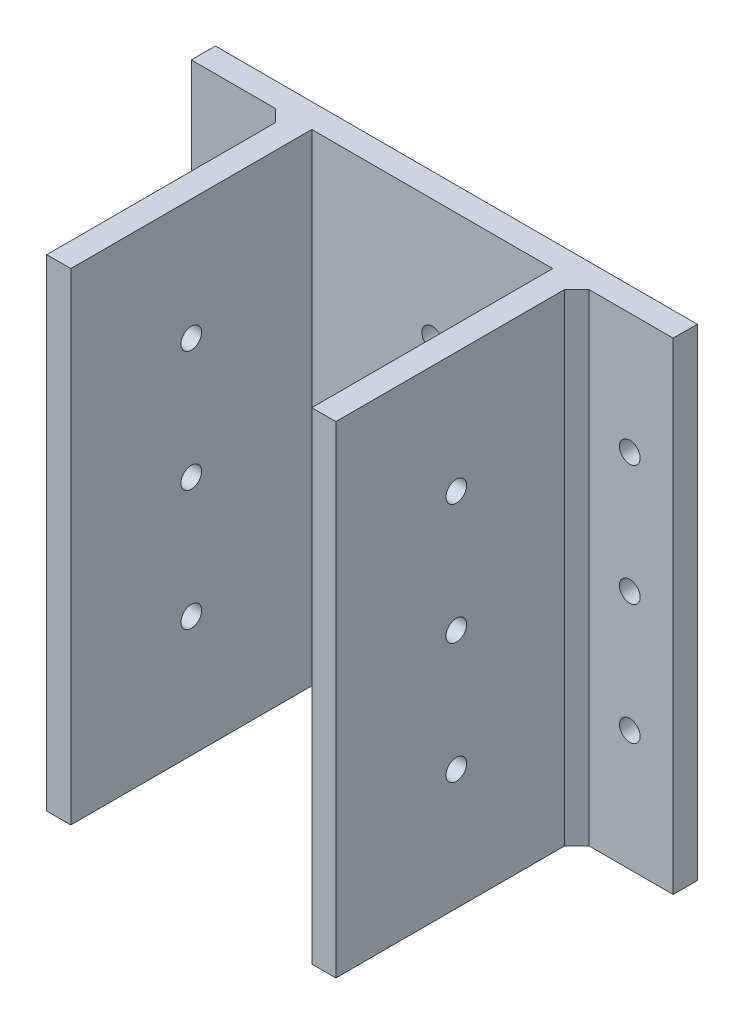
ISO-10303-21;
HEADER;
FILE_DESCRIPTION(('STEP AP214'),'2;1');
FILE_NAME('part.step','',(''),(''),'','','');
FILE_SCHEMA(('AUTOMOTIVE_DESIGN { 1 0 10303 214 1 1 1 1 }'));
ENDSEC;
DATA;
#1=APPLICATION_CONTEXT('core data for automotive mechanical design processes');
#2=APPLICATION_PROTOCOL_DEFINITION('international standard','automotive_design',2000,#1);
#3=PRODUCT_CONTEXT('',#1,'mechanical');
#4=PRODUCT('Part','Part','',(#3));
#5=PRODUCT_RELATED_PRODUCT_CATEGORY('part','',(#4));
#6=PRODUCT_DEFINITION_FORMATION('','',#4);
#7=PRODUCT_DEFINITION_CONTEXT('part definition',#1,'design');
#8=PRODUCT_DEFINITION('design','',#6,#7);
#9=PRODUCT_DEFINITION_SHAPE('','',#8);
#10=(LENGTH_UNIT() NAMED_UNIT(*) SI_UNIT(.MILLI.,.METRE.));
#11=(NAMED_UNIT(*) PLANE_ANGLE_UNIT() SI_UNIT($,.RADIAN.));
#12=(NAMED_UNIT(*) SI_UNIT($,.STERADIAN.) SOLID_ANGLE_UNIT());
#13=UNCERTAINTY_MEASURE_WITH_UNIT(LENGTH_MEASURE(1.E-05),#10,'distance_accuracy_value','');
#14=(GEOMETRIC_REPRESENTATION_CONTEXT(3) GLOBAL_UNCERTAINTY_ASSIGNED_CONTEXT((#13)) GLOBAL_UNIT_ASSIGNED_CONTEXT((#10,
#11,#12)) REPRESENTATION_CONTEXT('',''));
#15=CARTESIAN_POINT('',(0.,0.,0.));
#16=DIRECTION('',(0.,0.,1.));
#17=DIRECTION('',(1.,0.,0.));
#18=AXIS2_PLACEMENT_3D('',#15,#16,#17);
#19=CARTESIAN_POINT('',(0.,-25.,10.));
#20=DIRECTION('',(0.,0.,-1.));
#21=DIRECTION('',(-1.,0.,0.));
#22=AXIS2_PLACEMENT_3D('',#19,#20,#21);
#23=CYLINDRICAL_SURFACE('',#22,2.15);
#24=CARTESIAN_POINT('',(0.,-25.,5.));
#25=DIRECTION('',(0.,0.,1.));
#26=DIRECTION('',(1.,0.,0.));
#27=AXIS2_PLACEMENT_3D('',#24,#25,#26);
#28=CIRCLE('',#27,2.15);
#29=CARTESIAN_POINT('',(2.15000000000001,-25.,5.));
#30=VERTEX_POINT('',#29);
#31=EDGE_CURVE('E274',#30,#30,#28,.T.);
#32=ORIENTED_EDGE('',*,*,#31,.T.);
#33=EDGE_LOOP('',(#32));
#34=FACE_BOUND('',#33,.T.);
#35=CARTESIAN_POINT('',(0.,-25.,0.));
#36=DIRECTION('',(0.,0.,-1.));
#37=DIRECTION('',(-1.,0.,0.));
#38=AXIS2_PLACEMENT_3D('',#35,#36,#37);
#39=CIRCLE('',#38,2.15);
#40=CARTESIAN_POINT('',(-2.14999999999999,-25.,0.));
#41=VERTEX_POINT('',#40);
#42=EDGE_CURVE('E278',#41,#41,#39,.T.);
#43=ORIENTED_EDGE('',*,*,#42,.T.);
#44=EDGE_LOOP('',(#43));
#45=FACE_BOUND('',#44,.T.);
#46=ADVANCED_FACE('F41',(#34,#45),#23,.F.);
#47=CARTESIAN_POINT('',(0.,0.,5.));
#48=DIRECTION('',(0.,0.,1.));
#49=DIRECTION('',(1.,0.,0.));
#50=AXIS2_PLACEMENT_3D('',#47,#48,#49);
#51=PLANE('',#50);
#52=CARTESIAN_POINT('',(-41.,25.,5.));
#53=DIRECTION('',(0.,0.,1.));
#54=DIRECTION('',(1.,0.,0.));
#55=AXIS2_PLACEMENT_3D('',#52,#53,#54);
#56=CIRCLE('',#55,2.15);
#57=CARTESIAN_POINT('',(-38.85,25.,5.));
#58=VERTEX_POINT('',#57);
#59=EDGE_CURVE('E505',#58,#58,#56,.T.);
#60=ORIENTED_EDGE('',*,*,#59,.F.);
#61=EDGE_LOOP('',(#60));
#62=FACE_BOUND('',#61,.T.);
#63=CARTESIAN_POINT('',(-41.,0.,5.));
#64=DIRECTION('',(0.,0.,1.));
#65=DIRECTION('',(1.,0.,0.));
#66=AXIS2_PLACEMENT_3D('',#63,#64,#65);
#67=CIRCLE('',#66,2.15);
#68=CARTESIAN_POINT('',(-38.85,0.,5.));
#69=VERTEX_POINT('',#68);
#70=EDGE_CURVE('E501',#69,#69,#67,.T.);
#71=ORIENTED_EDGE('',*,*,#70,.F.);
#72=EDGE_LOOP('',(#71));
#73=FACE_BOUND('',#72,.T.);
#74=CARTESIAN_POINT('',(-41.,-25.,5.));
#75=DIRECTION('',(0.,0.,1.));
#76=DIRECTION('',(1.,0.,0.));
#77=AXIS2_PLACEMENT_3D('',#74,#75,#76);
#78=CIRCLE('',#77,2.15);
#79=CARTESIAN_POINT('',(-38.85,-25.,5.));
#80=VERTEX_POINT('',#79);
#81=EDGE_CURVE('E490',#80,#80,#78,.T.);
#82=ORIENTED_EDGE('',*,*,#81,.F.);
#83=EDGE_LOOP('',(#82));
#84=FACE_BOUND('',#83,.T.);
#85=DIRECTION('',(1.,0.,0.));
#86=VECTOR('',#85,1.);
#87=CARTESIAN_POINT('',(-50.,-50.,5.));
#88=LINE('',#87,#86);
#89=CARTESIAN_POINT('',(-50.,-50.,5.));
#90=VERTEX_POINT('',#89);
#91=CARTESIAN_POINT('',(-32.5,-50.,5.));
#92=VERTEX_POINT('',#91);
#93=EDGE_CURVE('E234',#90,#92,#88,.T.);
#94=ORIENTED_EDGE('',*,*,#93,.T.);
#95=DIRECTION('',(0.,1.,0.));
#96=VECTOR('',#95,1.);
#97=CARTESIAN_POINT('',(-32.5,0.,5.));
#98=LINE('',#97,#96);
#99=CARTESIAN_POINT('',(-32.5,50.,5.));
#100=VERTEX_POINT('',#99);
#101=EDGE_CURVE('E286',#92,#100,#98,.T.);
#102=ORIENTED_EDGE('',*,*,#101,.T.);
#103=DIRECTION('',(-1.,0.,0.));
#104=VECTOR('',#103,1.);
#105=CARTESIAN_POINT('',(-50.,50.,5.));
#106=LINE('',#105,#104);
#107=CARTESIAN_POINT('',(-50.,50.,5.));
#108=VERTEX_POINT('',#107);
#109=EDGE_CURVE('E241',#100,#108,#106,.T.);
#110=ORIENTED_EDGE('',*,*,#109,.T.);
#111=DIRECTION('',(0.,-1.,0.));
#112=VECTOR('',#111,1.);
#113=CARTESIAN_POINT('',(-50.,50.,5.));
#114=LINE('',#113,#112);
#115=EDGE_CURVE('E228',#108,#90,#114,.T.);
#116=ORIENTED_EDGE('',*,*,#115,.T.);
#117=EDGE_LOOP('',(#94,#102,#110,#116));
#118=FACE_BOUND('',#117,.T.);
#119=ADVANCED_FACE('F334',(#62,#73,#84,#118),#51,.T.);
#120=CARTESIAN_POINT('',(41.,25.,5.));
#121=DIRECTION('',(0.,0.,1.));
#122=DIRECTION('',(1.,0.,0.));
#123=AXIS2_PLACEMENT_3D('',#120,#121,#122);
#124=CIRCLE('',#123,2.15);
#125=CARTESIAN_POINT('',(43.15,25.,5.));
#126=VERTEX_POINT('',#125);
#127=EDGE_CURVE('E529',#126,#126,#124,.F.);
#128=ORIENTED_EDGE('',*,*,#127,.T.);
#129=EDGE_LOOP('',(#128));
#130=FACE_BOUND('',#129,.T.);
#131=CARTESIAN_POINT('',(41.,0.,5.));
#132=DIRECTION('',(0.,0.,1.));
#133=DIRECTION('',(1.,0.,0.));
#134=AXIS2_PLACEMENT_3D('',#131,#132,#133);
#135=CIRCLE('',#134,2.15);
#136=CARTESIAN_POINT('',(43.15,0.,5.));
#137=VERTEX_POINT('',#136);
#138=EDGE_CURVE('E525',#137,#137,#135,.F.);
#139=ORIENTED_EDGE('',*,*,#138,.T.);
#140=EDGE_LOOP('',(#139));
#141=FACE_BOUND('',#140,.T.);
#142=CARTESIAN_POINT('',(41.,-25.,5.));
#143=DIRECTION('',(0.,0.,1.));
#144=DIRECTION('',(1.,0.,0.));
#145=AXIS2_PLACEMENT_3D('',#142,#143,#144);
#146=CIRCLE('',#145,2.15);
#147=CARTESIAN_POINT('',(43.15,-25.,5.));
#148=VERTEX_POINT('',#147);
#149=EDGE_CURVE('E514',#148,#148,#146,.F.);
#150=ORIENTED_EDGE('',*,*,#149,.T.);
#151=EDGE_LOOP('',(#150));
#152=FACE_BOUND('',#151,.T.);
#153=CARTESIAN_POINT('',(50.,50.,5.));
#154=VERTEX_POINT('',#153);
#155=CARTESIAN_POINT('',(32.5,50.,5.));
#156=VERTEX_POINT('',#155);
#157=EDGE_CURVE('E242',#154,#156,#106,.T.);
#158=ORIENTED_EDGE('',*,*,#157,.T.);
#159=DIRECTION('',(0.,-1.,0.));
#160=VECTOR('',#159,1.);
#161=CARTESIAN_POINT('',(32.5,-50.,5.));
#162=LINE('',#161,#160);
#163=CARTESIAN_POINT('',(32.5000000000001,-50.,5.));
#164=VERTEX_POINT('',#163);
#165=EDGE_CURVE('E289',#156,#164,#162,.T.);
#166=ORIENTED_EDGE('',*,*,#165,.T.);
#167=CARTESIAN_POINT('',(50.,-50.,5.));
#168=VERTEX_POINT('',#167);
#169=EDGE_CURVE('E232',#164,#168,#88,.T.);
#170=ORIENTED_EDGE('',*,*,#169,.T.);
#171=DIRECTION('',(0.,1.,0.));
#172=VECTOR('',#171,1.);
#173=CARTESIAN_POINT('',(50.,50.,5.));
#174=LINE('',#173,#172);
#175=EDGE_CURVE('E238',#168,#154,#174,.T.);
#176=ORIENTED_EDGE('',*,*,#175,.T.);
#177=EDGE_LOOP('',(#158,#166,#170,#176));
#178=FACE_BOUND('',#177,.T.);
#179=ADVANCED_FACE('F308',(#130,#141,#152,#178),#51,.T.);
#180=CARTESIAN_POINT('',(-50.,50.,5.));
#181=DIRECTION('',(1.,0.,0.));
#182=DIRECTION('',(0.,1.,0.));
#183=AXIS2_PLACEMENT_3D('',#180,#181,#182);
#184=PLANE('',#183);
#185=DIRECTION('',(0.,-1.,0.));
#186=VECTOR('',#185,1.);
#187=CARTESIAN_POINT('',(-50.,50.,0.));
#188=LINE('',#187,#186);
#189=CARTESIAN_POINT('',(-50.,50.,0.));
#190=VERTEX_POINT('',#189);
#191=CARTESIAN_POINT('',(-50.,-50.,0.));
#192=VERTEX_POINT('',#191);
#193=EDGE_CURVE('E227',#190,#192,#188,.T.);
#194=ORIENTED_EDGE('',*,*,#193,.T.);
#195=DIRECTION('',(0.,0.,-1.));
#196=VECTOR('',#195,1.);
#197=CARTESIAN_POINT('',(-50.,-50.,5.));
#198=LINE('',#197,#196);
#199=EDGE_CURVE('E270',#90,#192,#198,.T.);
#200=ORIENTED_EDGE('',*,*,#199,.F.);
#201=ORIENTED_EDGE('',*,*,#115,.F.);
#202=DIRECTION('',(0.,0.,-1.));
#203=VECTOR('',#202,1.);
#204=CARTESIAN_POINT('',(-50.,50.,5.));
#205=LINE('',#204,#203);
#206=EDGE_CURVE('E246',#108,#190,#205,.T.);
#207=ORIENTED_EDGE('',*,*,#206,.T.);
#208=EDGE_LOOP('',(#194,#200,#201,#207));
#209=FACE_BOUND('',#208,.T.);
#210=ADVANCED_FACE('F345',(#209),#184,.F.);
#211=CARTESIAN_POINT('',(-50.,-50.,5.));
#212=DIRECTION('',(0.,1.,0.));
#213=DIRECTION('',(0.,0.,1.));
#214=AXIS2_PLACEMENT_3D('',#211,#212,#213);
#215=PLANE('',#214);
#216=DIRECTION('',(1.,0.,0.));
#217=VECTOR('',#216,1.);
#218=CARTESIAN_POINT('',(-50.,-50.,0.));
#219=LINE('',#218,#217);
#220=CARTESIAN_POINT('',(50.,-50.,0.));
#221=VERTEX_POINT('',#220);
#222=EDGE_CURVE('E251',#192,#221,#219,.T.);
#223=ORIENTED_EDGE('',*,*,#222,.T.);
#224=DIRECTION('',(0.,0.,-1.));
#225=VECTOR('',#224,1.);
#226=CARTESIAN_POINT('',(50.,-50.,5.));
#227=LINE('',#226,#225);
#228=EDGE_CURVE('E266',#168,#221,#227,.T.);
#229=ORIENTED_EDGE('',*,*,#228,.F.);
#230=ORIENTED_EDGE('',*,*,#169,.F.);
#231=DIRECTION('',(0.707106781186552,0.,-0.707106781186543));
#232=VECTOR('',#231,1.);
#233=CARTESIAN_POINT('',(-8.75000000000047,-50.,46.25));
#234=LINE('',#233,#232);
#235=CARTESIAN_POINT('',(30.,-50.,7.5));
#236=VERTEX_POINT('',#235);
#237=EDGE_CURVE('E51',#164,#236,#234,.F.);
#238=ORIENTED_EDGE('',*,*,#237,.T.);
#239=DIRECTION('',(0.,0.,-1.));
#240=VECTOR('',#239,1.);
#241=CARTESIAN_POINT('',(30.,-50.,55.));
#242=LINE('',#241,#240);
#243=CARTESIAN_POINT('',(30.,-50.,55.));
#244=VERTEX_POINT('',#243);
#245=EDGE_CURVE('E224',#244,#236,#242,.T.);
#246=ORIENTED_EDGE('',*,*,#245,.F.);
#247=DIRECTION('',(1.,0.,0.));
#248=VECTOR('',#247,1.);
#249=CARTESIAN_POINT('',(25.,-50.,55.));
#250=LINE('',#249,#248);
#251=CARTESIAN_POINT('',(25.,-50.,55.));
#252=VERTEX_POINT('',#251);
#253=EDGE_CURVE('E198',#252,#244,#250,.T.);
#254=ORIENTED_EDGE('',*,*,#253,.F.);
#255=DIRECTION('',(0.,0.,-1.));
#256=VECTOR('',#255,1.);
#257=CARTESIAN_POINT('',(25.,-50.,55.));
#258=LINE('',#257,#256);
#259=CARTESIAN_POINT('',(25.,-50.,5.));
#260=VERTEX_POINT('',#259);
#261=EDGE_CURVE('E212',#252,#260,#258,.T.);
#262=ORIENTED_EDGE('',*,*,#261,.T.);
#263=CARTESIAN_POINT('',(-25.,-50.,5.));
#264=VERTEX_POINT('',#263);
#265=EDGE_CURVE('E148',#264,#260,#88,.T.);
#266=ORIENTED_EDGE('',*,*,#265,.F.);
#267=DIRECTION('',(0.,0.,-1.));
#268=VECTOR('',#267,1.);
#269=CARTESIAN_POINT('',(-25.,-50.,55.));
#270=LINE('',#269,#268);
#271=CARTESIAN_POINT('',(-25.,-50.,55.));
#272=VERTEX_POINT('',#271);
#273=EDGE_CURVE('E142',#272,#264,#270,.T.);
#274=ORIENTED_EDGE('',*,*,#273,.F.);
#275=DIRECTION('',(-1.,0.,0.));
#276=VECTOR('',#275,1.);
#277=CARTESIAN_POINT('',(-25.,-50.,55.));
#278=LINE('',#277,#276);
#279=CARTESIAN_POINT('',(-30.,-50.,55.));
#280=VERTEX_POINT('',#279);
#281=EDGE_CURVE('E146',#272,#280,#278,.T.);
#282=ORIENTED_EDGE('',*,*,#281,.T.);
#283=DIRECTION('',(0.,0.,-1.));
#284=VECTOR('',#283,1.);
#285=CARTESIAN_POINT('',(-30.,-50.,55.));
#286=LINE('',#285,#284);
#287=CARTESIAN_POINT('',(-30.,-50.,7.5));
#288=VERTEX_POINT('',#287);
#289=EDGE_CURVE('E178',#280,#288,#286,.T.);
#290=ORIENTED_EDGE('',*,*,#289,.T.);
#291=DIRECTION('',(-0.707106781186544,0.,-0.707106781186551));
#292=VECTOR('',#291,1.);
#293=CARTESIAN_POINT('',(-41.2499999999999,-50.,-3.75));
#294=LINE('',#293,#292);
#295=EDGE_CURVE('E295',#288,#92,#294,.T.);
#296=ORIENTED_EDGE('',*,*,#295,.T.);
#297=ORIENTED_EDGE('',*,*,#93,.F.);
#298=ORIENTED_EDGE('',*,*,#199,.T.);
#299=EDGE_LOOP('',(#223,#229,#230,#238,#246,#254,#262,#266,#274,#282,#290,#296,#297,#298));
#300=FACE_BOUND('',#299,.T.);
#301=ADVANCED_FACE('F144',(#300),#215,.F.);
#302=CARTESIAN_POINT('',(50.,50.,5.));
#303=DIRECTION('',(-1.,0.,0.));
#304=DIRECTION('',(0.,-1.,0.));
#305=AXIS2_PLACEMENT_3D('',#302,#303,#304);
#306=PLANE('',#305);
#307=DIRECTION('',(0.,1.,0.));
#308=VECTOR('',#307,1.);
#309=CARTESIAN_POINT('',(50.,50.,0.));
#310=LINE('',#309,#308);
#311=CARTESIAN_POINT('',(50.,50.,0.));
#312=VERTEX_POINT('',#311);
#313=EDGE_CURVE('E254',#221,#312,#310,.T.);
#314=ORIENTED_EDGE('',*,*,#313,.T.);
#315=DIRECTION('',(0.,0.,-1.));
#316=VECTOR('',#315,1.);
#317=CARTESIAN_POINT('',(50.,50.,5.));
#318=LINE('',#317,#316);
#319=EDGE_CURVE('E262',#154,#312,#318,.T.);
#320=ORIENTED_EDGE('',*,*,#319,.F.);
#321=ORIENTED_EDGE('',*,*,#175,.F.);
#322=ORIENTED_EDGE('',*,*,#228,.T.);
#323=EDGE_LOOP('',(#314,#320,#321,#322));
#324=FACE_BOUND('',#323,.T.);
#325=ADVANCED_FACE('F314',(#324),#306,.F.);
#326=CARTESIAN_POINT('',(-50.,50.,5.));
#327=DIRECTION('',(0.,-1.,0.));
#328=DIRECTION('',(0.,0.,-1.));
#329=AXIS2_PLACEMENT_3D('',#326,#327,#328);
#330=PLANE('',#329);
#331=DIRECTION('',(-1.,0.,0.));
#332=VECTOR('',#331,1.);
#333=CARTESIAN_POINT('',(-50.,50.,0.));
#334=LINE('',#333,#332);
#335=EDGE_CURVE('E233',#312,#190,#334,.T.);
#336=ORIENTED_EDGE('',*,*,#335,.T.);
#337=ORIENTED_EDGE('',*,*,#206,.F.);
#338=ORIENTED_EDGE('',*,*,#109,.F.);
#339=DIRECTION('',(0.707106781186544,0.,0.707106781186551));
#340=VECTOR('',#339,1.);
#341=CARTESIAN_POINT('',(-41.2499999999999,50.,-3.75000000000001));
#342=LINE('',#341,#340);
#343=CARTESIAN_POINT('',(-30.,50.,7.5));
#344=VERTEX_POINT('',#343);
#345=EDGE_CURVE('E298',#100,#344,#342,.T.);
#346=ORIENTED_EDGE('',*,*,#345,.T.);
#347=DIRECTION('',(0.,0.,-1.));
#348=VECTOR('',#347,1.);
#349=CARTESIAN_POINT('',(-30.,50.,55.));
#350=LINE('',#349,#348);
#351=CARTESIAN_POINT('',(-30.,50.,55.));
#352=VERTEX_POINT('',#351);
#353=EDGE_CURVE('E184',#352,#344,#350,.T.);
#354=ORIENTED_EDGE('',*,*,#353,.F.);
#355=DIRECTION('',(-1.,0.,0.));
#356=VECTOR('',#355,1.);
#357=CARTESIAN_POINT('',(-25.,50.,55.));
#358=LINE('',#357,#356);
#359=CARTESIAN_POINT('',(-25.,50.,55.));
#360=VERTEX_POINT('',#359);
#361=EDGE_CURVE('E170',#360,#352,#358,.T.);
#362=ORIENTED_EDGE('',*,*,#361,.F.);
#363=DIRECTION('',(0.,0.,-1.));
#364=VECTOR('',#363,1.);
#365=CARTESIAN_POINT('',(-25.,50.,55.));
#366=LINE('',#365,#364);
#367=CARTESIAN_POINT('',(-25.,50.,5.));
#368=VERTEX_POINT('',#367);
#369=EDGE_CURVE('E155',#360,#368,#366,.T.);
#370=ORIENTED_EDGE('',*,*,#369,.T.);
#371=CARTESIAN_POINT('',(25.,50.,5.));
#372=VERTEX_POINT('',#371);
#373=EDGE_CURVE('E247',#372,#368,#106,.T.);
#374=ORIENTED_EDGE('',*,*,#373,.F.);
#375=DIRECTION('',(0.,0.,-1.));
#376=VECTOR('',#375,1.);
#377=CARTESIAN_POINT('',(25.,50.,55.));
#378=LINE('',#377,#376);
#379=CARTESIAN_POINT('',(25.,50.,55.));
#380=VERTEX_POINT('',#379);
#381=EDGE_CURVE('E218',#380,#372,#378,.T.);
#382=ORIENTED_EDGE('',*,*,#381,.F.);
#383=DIRECTION('',(1.,0.,0.));
#384=VECTOR('',#383,1.);
#385=CARTESIAN_POINT('',(25.,50.,55.));
#386=LINE('',#385,#384);
#387=CARTESIAN_POINT('',(30.,50.,55.));
#388=VERTEX_POINT('',#387);
#389=EDGE_CURVE('E205',#380,#388,#386,.T.);
#390=ORIENTED_EDGE('',*,*,#389,.T.);
#391=DIRECTION('',(0.,0.,-1.));
#392=VECTOR('',#391,1.);
#393=CARTESIAN_POINT('',(30.,50.,55.));
#394=LINE('',#393,#392);
#395=CARTESIAN_POINT('',(30.,50.,7.5));
#396=VERTEX_POINT('',#395);
#397=EDGE_CURVE('E221',#388,#396,#394,.T.);
#398=ORIENTED_EDGE('',*,*,#397,.T.);
#399=DIRECTION('',(-0.707106781186552,0.,0.707106781186543));
#400=VECTOR('',#399,1.);
#401=CARTESIAN_POINT('',(-8.75000000000049,50.,46.25));
#402=LINE('',#401,#400);
#403=EDGE_CURVE('E11',#396,#156,#402,.F.);
#404=ORIENTED_EDGE('',*,*,#403,.T.);
#405=ORIENTED_EDGE('',*,*,#157,.F.);
#406=ORIENTED_EDGE('',*,*,#319,.T.);
#407=EDGE_LOOP('',(#336,#337,#338,#346,#354,#362,#370,#374,#382,#390,#398,#404,#405,#406));
#408=FACE_BOUND('',#407,.T.);
#409=ADVANCED_FACE('F318',(#408),#330,.F.);
#410=CARTESIAN_POINT('',(0.,0.,5.));
#411=DIRECTION('',(0.,0.,1.));
#412=DIRECTION('',(1.,0.,0.));
#413=AXIS2_PLACEMENT_3D('',#410,#411,#412);
#414=CIRCLE('',#413,2.15);
#415=CARTESIAN_POINT('',(2.15,0.,5.));
#416=VERTEX_POINT('',#415);
#417=EDGE_CURVE('E533',#416,#416,#414,.T.);
#418=ORIENTED_EDGE('',*,*,#417,.F.);
#419=EDGE_LOOP('',(#418));
#420=FACE_BOUND('',#419,.T.);
#421=DIRECTION('',(0.,-1.,0.));
#422=VECTOR('',#421,1.);
#423=CARTESIAN_POINT('',(-25.,50.,5.));
#424=LINE('',#423,#422);
#425=EDGE_CURVE('E165',#368,#264,#424,.T.);
#426=ORIENTED_EDGE('',*,*,#425,.T.);
#427=ORIENTED_EDGE('',*,*,#265,.T.);
#428=DIRECTION('',(0.,-1.,0.));
#429=VECTOR('',#428,1.);
#430=CARTESIAN_POINT('',(25.,50.,5.));
#431=LINE('',#430,#429);
#432=EDGE_CURVE('E197',#372,#260,#431,.T.);
#433=ORIENTED_EDGE('',*,*,#432,.F.);
#434=ORIENTED_EDGE('',*,*,#373,.T.);
#435=EDGE_LOOP('',(#426,#427,#433,#434));
#436=FACE_BOUND('',#435,.T.);
#437=CARTESIAN_POINT('',(0.,25.,5.));
#438=DIRECTION('',(0.,0.,1.));
#439=DIRECTION('',(1.,0.,0.));
#440=AXIS2_PLACEMENT_3D('',#437,#438,#439);
#441=CIRCLE('',#440,2.15);
#442=CARTESIAN_POINT('',(2.15,25.,5.));
#443=VERTEX_POINT('',#442);
#444=EDGE_CURVE('E193',#443,#443,#441,.T.);
#445=ORIENTED_EDGE('',*,*,#444,.F.);
#446=EDGE_LOOP('',(#445));
#447=FACE_BOUND('',#446,.T.);
#448=ORIENTED_EDGE('',*,*,#31,.F.);
#449=EDGE_LOOP('',(#448));
#450=FACE_BOUND('',#449,.T.);
#451=ADVANCED_FACE('F342',(#420,#436,#447,#450),#51,.T.);
#452=CARTESIAN_POINT('',(0.,0.,0.));
#453=DIRECTION('',(0.,0.,1.));
#454=DIRECTION('',(1.,0.,0.));
#455=AXIS2_PLACEMENT_3D('',#452,#453,#454);
#456=PLANE('',#455);
#457=CARTESIAN_POINT('',(-41.,25.,0.));
#458=DIRECTION('',(0.,0.,-1.));
#459=DIRECTION('',(-1.,0.,0.));
#460=AXIS2_PLACEMENT_3D('',#457,#458,#459);
#461=CIRCLE('',#460,2.15);
#462=CARTESIAN_POINT('',(-43.15,25.,0.));
#463=VERTEX_POINT('',#462);
#464=EDGE_CURVE('E486',#463,#463,#461,.T.);
#465=ORIENTED_EDGE('',*,*,#464,.F.);
#466=EDGE_LOOP('',(#465));
#467=FACE_BOUND('',#466,.T.);
#468=CARTESIAN_POINT('',(-41.,0.,0.));
#469=DIRECTION('',(0.,0.,-1.));
#470=DIRECTION('',(-1.,0.,0.));
#471=AXIS2_PLACEMENT_3D('',#468,#469,#470);
#472=CIRCLE('',#471,2.15);
#473=CARTESIAN_POINT('',(-43.15,0.,0.));
#474=VERTEX_POINT('',#473);
#475=EDGE_CURVE('E491',#474,#474,#472,.T.);
#476=ORIENTED_EDGE('',*,*,#475,.F.);
#477=EDGE_LOOP('',(#476));
#478=FACE_BOUND('',#477,.T.);
#479=CARTESIAN_POINT('',(-41.,-25.,0.));
#480=DIRECTION('',(0.,0.,-1.));
#481=DIRECTION('',(-1.,0.,0.));
#482=AXIS2_PLACEMENT_3D('',#479,#480,#481);
#483=CIRCLE('',#482,2.15);
#484=CARTESIAN_POINT('',(-43.15,-25.,0.));
#485=VERTEX_POINT('',#484);
#486=EDGE_CURVE('E485',#485,#485,#483,.T.);
#487=ORIENTED_EDGE('',*,*,#486,.F.);
#488=EDGE_LOOP('',(#487));
#489=FACE_BOUND('',#488,.T.);
#490=CARTESIAN_POINT('',(41.,25.,0.));
#491=DIRECTION('',(0.,0.,1.));
#492=DIRECTION('',(1.,0.,0.));
#493=AXIS2_PLACEMENT_3D('',#490,#491,#492);
#494=CIRCLE('',#493,2.15);
#495=CARTESIAN_POINT('',(43.15,25.,0.));
#496=VERTEX_POINT('',#495);
#497=EDGE_CURVE('E510',#496,#496,#494,.T.);
#498=ORIENTED_EDGE('',*,*,#497,.T.);
#499=EDGE_LOOP('',(#498));
#500=FACE_BOUND('',#499,.T.);
#501=CARTESIAN_POINT('',(41.,0.,0.));
#502=DIRECTION('',(0.,0.,1.));
#503=DIRECTION('',(1.,0.,0.));
#504=AXIS2_PLACEMENT_3D('',#501,#502,#503);
#505=CIRCLE('',#504,2.15);
#506=CARTESIAN_POINT('',(43.15,0.,0.));
#507=VERTEX_POINT('',#506);
#508=EDGE_CURVE('E515',#507,#507,#505,.T.);
#509=ORIENTED_EDGE('',*,*,#508,.T.);
#510=EDGE_LOOP('',(#509));
#511=FACE_BOUND('',#510,.T.);
#512=CARTESIAN_POINT('',(41.,-25.,0.));
#513=DIRECTION('',(0.,0.,1.));
#514=DIRECTION('',(1.,0.,0.));
#515=AXIS2_PLACEMENT_3D('',#512,#513,#514);
#516=CIRCLE('',#515,2.15);
#517=CARTESIAN_POINT('',(43.15,-25.,0.));
#518=VERTEX_POINT('',#517);
#519=EDGE_CURVE('E509',#518,#518,#516,.T.);
#520=ORIENTED_EDGE('',*,*,#519,.T.);
#521=EDGE_LOOP('',(#520));
#522=FACE_BOUND('',#521,.T.);
#523=CARTESIAN_POINT('',(0.,0.,0.));
#524=DIRECTION('',(0.,0.,-1.));
#525=DIRECTION('',(-1.,0.,0.));
#526=AXIS2_PLACEMENT_3D('',#523,#524,#525);
#527=CIRCLE('',#526,2.15);
#528=CARTESIAN_POINT('',(-2.15,0.,0.));
#529=VERTEX_POINT('',#528);
#530=EDGE_CURVE('E181',#529,#529,#527,.T.);
#531=ORIENTED_EDGE('',*,*,#530,.F.);
#532=EDGE_LOOP('',(#531));
#533=FACE_BOUND('',#532,.T.);
#534=CARTESIAN_POINT('',(0.,25.,0.));
#535=DIRECTION('',(0.,0.,-1.));
#536=DIRECTION('',(-1.,0.,0.));
#537=AXIS2_PLACEMENT_3D('',#534,#535,#536);
#538=CIRCLE('',#537,2.15);
#539=CARTESIAN_POINT('',(-2.15,25.,0.));
#540=VERTEX_POINT('',#539);
#541=EDGE_CURVE('E154',#540,#540,#538,.T.);
#542=ORIENTED_EDGE('',*,*,#541,.F.);
#543=EDGE_LOOP('',(#542));
#544=FACE_BOUND('',#543,.T.);
#545=ORIENTED_EDGE('',*,*,#193,.F.);
#546=ORIENTED_EDGE('',*,*,#335,.F.);
#547=ORIENTED_EDGE('',*,*,#313,.F.);
#548=ORIENTED_EDGE('',*,*,#222,.F.);
#549=EDGE_LOOP('',(#545,#546,#547,#548));
#550=FACE_BOUND('',#549,.T.);
#551=ORIENTED_EDGE('',*,*,#42,.F.);
#552=EDGE_LOOP('',(#551));
#553=FACE_BOUND('',#552,.T.);
#554=ADVANCED_FACE('F360',(#467,#478,#489,#500,#511,#522,#533,#544,#550,#553),#456,.F.);
#555=CARTESIAN_POINT('',(30.,50.,55.));
#556=DIRECTION('',(1.,0.,0.));
#557=DIRECTION('',(0.,1.,0.));
#558=AXIS2_PLACEMENT_3D('',#555,#556,#557);
#559=PLANE('',#558);
#560=CARTESIAN_POINT('',(30.,-25.,30.0000000000015));
#561=DIRECTION('',(1.,0.,0.));
#562=DIRECTION('',(0.,1.,0.));
#563=AXIS2_PLACEMENT_3D('',#560,#561,#562);
#564=CIRCLE('',#563,2.15000000000004);
#565=CARTESIAN_POINT('',(30.,-22.85,30.0000000000015));
#566=VERTEX_POINT('',#565);
#567=EDGE_CURVE('E441',#566,#566,#564,.T.);
#568=ORIENTED_EDGE('',*,*,#567,.F.);
#569=EDGE_LOOP('',(#568));
#570=FACE_BOUND('',#569,.T.);
#571=CARTESIAN_POINT('',(30.,0.,30.0000000000015));
#572=DIRECTION('',(-1.,0.,0.));
#573=DIRECTION('',(0.,-1.,0.));
#574=AXIS2_PLACEMENT_3D('',#571,#572,#573);
#575=CIRCLE('',#574,2.15000000000007);
#576=CARTESIAN_POINT('',(30.,-2.15000000000011,30.0000000000015));
#577=VERTEX_POINT('',#576);
#578=EDGE_CURVE('E454',#577,#577,#575,.T.);
#579=ORIENTED_EDGE('',*,*,#578,.T.);
#580=EDGE_LOOP('',(#579));
#581=FACE_BOUND('',#580,.T.);
#582=CARTESIAN_POINT('',(30.,25.,30.0000000000015));
#583=DIRECTION('',(-1.,0.,0.));
#584=DIRECTION('',(0.,-1.,0.));
#585=AXIS2_PLACEMENT_3D('',#582,#583,#584);
#586=CIRCLE('',#585,2.15000000000004);
#587=CARTESIAN_POINT('',(30.,22.85,30.0000000000015));
#588=VERTEX_POINT('',#587);
#589=EDGE_CURVE('E470',#588,#588,#586,.T.);
#590=ORIENTED_EDGE('',*,*,#589,.T.);
#591=EDGE_LOOP('',(#590));
#592=FACE_BOUND('',#591,.T.);
#593=ORIENTED_EDGE('',*,*,#245,.T.);
#594=DIRECTION('',(0.,1.,0.));
#595=VECTOR('',#594,1.);
#596=CARTESIAN_POINT('',(30.,50.,7.5));
#597=LINE('',#596,#595);
#598=EDGE_CURVE('E64',#236,#396,#597,.T.);
#599=ORIENTED_EDGE('',*,*,#598,.T.);
#600=ORIENTED_EDGE('',*,*,#397,.F.);
#601=DIRECTION('',(0.,-1.,0.));
#602=VECTOR('',#601,1.);
#603=CARTESIAN_POINT('',(30.,50.,55.));
#604=LINE('',#603,#602);
#605=EDGE_CURVE('E201',#388,#244,#604,.T.);
#606=ORIENTED_EDGE('',*,*,#605,.T.);
#607=EDGE_LOOP('',(#593,#599,#600,#606));
#608=FACE_BOUND('',#607,.T.);
#609=ADVANCED_FACE('F362',(#570,#581,#592,#608),#559,.T.);
#610=CARTESIAN_POINT('',(25.,50.,55.));
#611=DIRECTION('',(1.,0.,0.));
#612=DIRECTION('',(0.,1.,0.));
#613=AXIS2_PLACEMENT_3D('',#610,#611,#612);
#614=PLANE('',#613);
#615=CARTESIAN_POINT('',(25.,-25.,30.0000000000015));
#616=DIRECTION('',(1.,0.,0.));
#617=DIRECTION('',(0.,1.,0.));
#618=AXIS2_PLACEMENT_3D('',#615,#616,#617);
#619=CIRCLE('',#618,2.15000000000004);
#620=CARTESIAN_POINT('',(25.,-22.85,30.0000000000015));
#621=VERTEX_POINT('',#620);
#622=EDGE_CURVE('E449',#621,#621,#619,.F.);
#623=ORIENTED_EDGE('',*,*,#622,.F.);
#624=EDGE_LOOP('',(#623));
#625=FACE_BOUND('',#624,.T.);
#626=CARTESIAN_POINT('',(25.,0.,30.0000000000015));
#627=DIRECTION('',(1.,0.,0.));
#628=DIRECTION('',(0.,1.,0.));
#629=AXIS2_PLACEMENT_3D('',#626,#627,#628);
#630=CIRCLE('',#629,2.15000000000007);
#631=CARTESIAN_POINT('',(25.,2.15000000000004,30.0000000000015));
#632=VERTEX_POINT('',#631);
#633=EDGE_CURVE('E465',#632,#632,#630,.T.);
#634=ORIENTED_EDGE('',*,*,#633,.T.);
#635=EDGE_LOOP('',(#634));
#636=FACE_BOUND('',#635,.T.);
#637=CARTESIAN_POINT('',(25.,25.,30.0000000000015));
#638=DIRECTION('',(1.,0.,0.));
#639=DIRECTION('',(0.,1.,0.));
#640=AXIS2_PLACEMENT_3D('',#637,#638,#639);
#641=CIRCLE('',#640,2.15000000000004);
#642=CARTESIAN_POINT('',(25.,27.15,30.0000000000015));
#643=VERTEX_POINT('',#642);
#644=EDGE_CURVE('E481',#643,#643,#641,.T.);
#645=ORIENTED_EDGE('',*,*,#644,.T.);
#646=EDGE_LOOP('',(#645));
#647=FACE_BOUND('',#646,.T.);
#648=ORIENTED_EDGE('',*,*,#432,.T.);
#649=ORIENTED_EDGE('',*,*,#261,.F.);
#650=DIRECTION('',(0.,-1.,0.));
#651=VECTOR('',#650,1.);
#652=CARTESIAN_POINT('',(25.,50.,55.));
#653=LINE('',#652,#651);
#654=EDGE_CURVE('E209',#380,#252,#653,.T.);
#655=ORIENTED_EDGE('',*,*,#654,.F.);
#656=ORIENTED_EDGE('',*,*,#381,.T.);
#657=EDGE_LOOP('',(#648,#649,#655,#656));
#658=FACE_BOUND('',#657,.T.);
#659=ADVANCED_FACE('F369',(#625,#636,#647,#658),#614,.F.);
#660=CARTESIAN_POINT('',(0.,0.,55.));
#661=DIRECTION('',(0.,0.,-1.));
#662=DIRECTION('',(-1.,0.,0.));
#663=AXIS2_PLACEMENT_3D('',#660,#661,#662);
#664=PLANE('',#663);
#665=ORIENTED_EDGE('',*,*,#253,.T.);
#666=ORIENTED_EDGE('',*,*,#605,.F.);
#667=ORIENTED_EDGE('',*,*,#389,.F.);
#668=ORIENTED_EDGE('',*,*,#654,.T.);
#669=EDGE_LOOP('',(#665,#666,#667,#668));
#670=FACE_BOUND('',#669,.T.);
#671=ADVANCED_FACE('F373',(#670),#664,.F.);
#672=CARTESIAN_POINT('',(0.,25.,10.));
#673=DIRECTION('',(0.,0.,-1.));
#674=DIRECTION('',(-1.,0.,0.));
#675=AXIS2_PLACEMENT_3D('',#672,#673,#674);
#676=CYLINDRICAL_SURFACE('',#675,2.15);
#677=ORIENTED_EDGE('',*,*,#444,.T.);
#678=EDGE_LOOP('',(#677));
#679=FACE_BOUND('',#678,.T.);
#680=ORIENTED_EDGE('',*,*,#541,.T.);
#681=EDGE_LOOP('',(#680));
#682=FACE_BOUND('',#681,.T.);
#683=ADVANCED_FACE('F377',(#679,#682),#676,.F.);
#684=CARTESIAN_POINT('',(-25.,50.,55.));
#685=DIRECTION('',(1.,0.,0.));
#686=DIRECTION('',(0.,1.,0.));
#687=AXIS2_PLACEMENT_3D('',#684,#685,#686);
#688=PLANE('',#687);
#689=CARTESIAN_POINT('',(-25.,-25.,30.0000000000015));
#690=DIRECTION('',(1.,0.,0.));
#691=DIRECTION('',(0.,1.,0.));
#692=AXIS2_PLACEMENT_3D('',#689,#690,#691);
#693=CIRCLE('',#692,2.15000000000004);
#694=CARTESIAN_POINT('',(-25.,-22.85,30.0000000000015));
#695=VERTEX_POINT('',#694);
#696=EDGE_CURVE('E436',#695,#695,#693,.F.);
#697=ORIENTED_EDGE('',*,*,#696,.T.);
#698=EDGE_LOOP('',(#697));
#699=FACE_BOUND('',#698,.T.);
#700=CARTESIAN_POINT('',(-25.,0.,30.0000000000015));
#701=DIRECTION('',(1.,0.,0.));
#702=DIRECTION('',(0.,1.,0.));
#703=AXIS2_PLACEMENT_3D('',#700,#701,#702);
#704=CIRCLE('',#703,2.15000000000007);
#705=CARTESIAN_POINT('',(-25.,2.15000000000005,30.0000000000015));
#706=VERTEX_POINT('',#705);
#707=EDGE_CURVE('E458',#706,#706,#704,.T.);
#708=ORIENTED_EDGE('',*,*,#707,.F.);
#709=EDGE_LOOP('',(#708));
#710=FACE_BOUND('',#709,.T.);
#711=CARTESIAN_POINT('',(-25.,25.,30.0000000000015));
#712=DIRECTION('',(1.,0.,0.));
#713=DIRECTION('',(0.,1.,0.));
#714=AXIS2_PLACEMENT_3D('',#711,#712,#713);
#715=CIRCLE('',#714,2.15000000000004);
#716=CARTESIAN_POINT('',(-25.,27.15,30.0000000000015));
#717=VERTEX_POINT('',#716);
#718=EDGE_CURVE('E474',#717,#717,#715,.T.);
#719=ORIENTED_EDGE('',*,*,#718,.F.);
#720=EDGE_LOOP('',(#719));
#721=FACE_BOUND('',#720,.T.);
#722=ORIENTED_EDGE('',*,*,#425,.F.);
#723=ORIENTED_EDGE('',*,*,#369,.F.);
#724=DIRECTION('',(0.,-1.,0.));
#725=VECTOR('',#724,1.);
#726=CARTESIAN_POINT('',(-25.,50.,55.));
#727=LINE('',#726,#725);
#728=EDGE_CURVE('E160',#360,#272,#727,.T.);
#729=ORIENTED_EDGE('',*,*,#728,.T.);
#730=ORIENTED_EDGE('',*,*,#273,.T.);
#731=EDGE_LOOP('',(#722,#723,#729,#730));
#732=FACE_BOUND('',#731,.T.);
#733=ADVANCED_FACE('F167',(#699,#710,#721,#732),#688,.T.);
#734=CARTESIAN_POINT('',(-30.,50.,55.));
#735=DIRECTION('',(1.,0.,0.));
#736=DIRECTION('',(0.,1.,0.));
#737=AXIS2_PLACEMENT_3D('',#734,#735,#736);
#738=PLANE('',#737);
#739=CARTESIAN_POINT('',(-30.,-25.,30.0000000000015));
#740=DIRECTION('',(1.,0.,0.));
#741=DIRECTION('',(0.,1.,0.));
#742=AXIS2_PLACEMENT_3D('',#739,#740,#741);
#743=CIRCLE('',#742,2.15000000000004);
#744=CARTESIAN_POINT('',(-30.,-22.85,30.0000000000015));
#745=VERTEX_POINT('',#744);
#746=EDGE_CURVE('E439',#745,#745,#743,.T.);
#747=ORIENTED_EDGE('',*,*,#746,.T.);
#748=EDGE_LOOP('',(#747));
#749=FACE_BOUND('',#748,.T.);
#750=CARTESIAN_POINT('',(-30.,0.,30.0000000000015));
#751=DIRECTION('',(-1.,0.,0.));
#752=DIRECTION('',(0.,-1.,0.));
#753=AXIS2_PLACEMENT_3D('',#750,#751,#752);
#754=CIRCLE('',#753,2.15000000000007);
#755=CARTESIAN_POINT('',(-30.,-2.1500000000001,30.0000000000015));
#756=VERTEX_POINT('',#755);
#757=EDGE_CURVE('E453',#756,#756,#754,.T.);
#758=ORIENTED_EDGE('',*,*,#757,.F.);
#759=EDGE_LOOP('',(#758));
#760=FACE_BOUND('',#759,.T.);
#761=CARTESIAN_POINT('',(-30.,25.,30.0000000000015));
#762=DIRECTION('',(-1.,0.,0.));
#763=DIRECTION('',(0.,-1.,0.));
#764=AXIS2_PLACEMENT_3D('',#761,#762,#763);
#765=CIRCLE('',#764,2.15000000000004);
#766=CARTESIAN_POINT('',(-30.,22.85,30.0000000000015));
#767=VERTEX_POINT('',#766);
#768=EDGE_CURVE('E469',#767,#767,#765,.T.);
#769=ORIENTED_EDGE('',*,*,#768,.F.);
#770=EDGE_LOOP('',(#769));
#771=FACE_BOUND('',#770,.T.);
#772=ORIENTED_EDGE('',*,*,#353,.T.);
#773=DIRECTION('',(0.,-1.,0.));
#774=VECTOR('',#773,1.);
#775=CARTESIAN_POINT('',(-30.,50.,7.5));
#776=LINE('',#775,#774);
#777=EDGE_CURVE('E282',#344,#288,#776,.T.);
#778=ORIENTED_EDGE('',*,*,#777,.T.);
#779=ORIENTED_EDGE('',*,*,#289,.F.);
#780=DIRECTION('',(0.,-1.,0.));
#781=VECTOR('',#780,1.);
#782=CARTESIAN_POINT('',(-30.,50.,55.));
#783=LINE('',#782,#781);
#784=EDGE_CURVE('E162',#352,#280,#783,.T.);
#785=ORIENTED_EDGE('',*,*,#784,.F.);
#786=EDGE_LOOP('',(#772,#778,#779,#785));
#787=FACE_BOUND('',#786,.T.);
#788=ADVANCED_FACE('F384',(#749,#760,#771,#787),#738,.F.);
#789=CARTESIAN_POINT('',(0.,0.,55.));
#790=DIRECTION('',(0.,0.,-1.));
#791=DIRECTION('',(1.,0.,0.));
#792=AXIS2_PLACEMENT_3D('',#789,#790,#791);
#793=PLANE('',#792);
#794=ORIENTED_EDGE('',*,*,#281,.F.);
#795=ORIENTED_EDGE('',*,*,#728,.F.);
#796=ORIENTED_EDGE('',*,*,#361,.T.);
#797=ORIENTED_EDGE('',*,*,#784,.T.);
#798=EDGE_LOOP('',(#794,#795,#796,#797));
#799=FACE_BOUND('',#798,.T.);
#800=ADVANCED_FACE('F159',(#799),#793,.F.);
#801=CARTESIAN_POINT('',(0.,0.,10.));
#802=DIRECTION('',(0.,0.,-1.));
#803=DIRECTION('',(-1.,0.,0.));
#804=AXIS2_PLACEMENT_3D('',#801,#802,#803);
#805=CYLINDRICAL_SURFACE('',#804,2.15);
#806=ORIENTED_EDGE('',*,*,#417,.T.);
#807=EDGE_LOOP('',(#806));
#808=FACE_BOUND('',#807,.T.);
#809=ORIENTED_EDGE('',*,*,#530,.T.);
#810=EDGE_LOOP('',(#809));
#811=FACE_BOUND('',#810,.T.);
#812=ADVANCED_FACE('F391',(#808,#811),#805,.F.);
#813=CARTESIAN_POINT('',(41.,-25.,10.));
#814=DIRECTION('',(0.,0.,-1.));
#815=DIRECTION('',(-1.,0.,0.));
#816=AXIS2_PLACEMENT_3D('',#813,#814,#815);
#817=CYLINDRICAL_SURFACE('',#816,2.15);
#818=ORIENTED_EDGE('',*,*,#149,.F.);
#819=EDGE_LOOP('',(#818));
#820=FACE_BOUND('',#819,.T.);
#821=ORIENTED_EDGE('',*,*,#519,.F.);
#822=EDGE_LOOP('',(#821));
#823=FACE_BOUND('',#822,.T.);
#824=ADVANCED_FACE('F394',(#820,#823),#817,.F.);
#825=CARTESIAN_POINT('',(41.,0.,10.));
#826=DIRECTION('',(0.,0.,-1.));
#827=DIRECTION('',(-1.,0.,0.));
#828=AXIS2_PLACEMENT_3D('',#825,#826,#827);
#829=CYLINDRICAL_SURFACE('',#828,2.15);
#830=ORIENTED_EDGE('',*,*,#138,.F.);
#831=EDGE_LOOP('',(#830));
#832=FACE_BOUND('',#831,.T.);
#833=ORIENTED_EDGE('',*,*,#508,.F.);
#834=EDGE_LOOP('',(#833));
#835=FACE_BOUND('',#834,.T.);
#836=ADVANCED_FACE('F398',(#832,#835),#829,.F.);
#837=CARTESIAN_POINT('',(41.,25.,10.));
#838=DIRECTION('',(0.,0.,-1.));
#839=DIRECTION('',(-1.,0.,0.));
#840=AXIS2_PLACEMENT_3D('',#837,#838,#839);
#841=CYLINDRICAL_SURFACE('',#840,2.15);
#842=ORIENTED_EDGE('',*,*,#127,.F.);
#843=EDGE_LOOP('',(#842));
#844=FACE_BOUND('',#843,.T.);
#845=ORIENTED_EDGE('',*,*,#497,.F.);
#846=EDGE_LOOP('',(#845));
#847=FACE_BOUND('',#846,.T.);
#848=ADVANCED_FACE('F402',(#844,#847),#841,.F.);
#849=CARTESIAN_POINT('',(-41.,-25.,10.));
#850=DIRECTION('',(0.,0.,-1.));
#851=DIRECTION('',(-1.,0.,0.));
#852=AXIS2_PLACEMENT_3D('',#849,#850,#851);
#853=CYLINDRICAL_SURFACE('',#852,2.15);
#854=ORIENTED_EDGE('',*,*,#81,.T.);
#855=EDGE_LOOP('',(#854));
#856=FACE_BOUND('',#855,.T.);
#857=ORIENTED_EDGE('',*,*,#486,.T.);
#858=EDGE_LOOP('',(#857));
#859=FACE_BOUND('',#858,.T.);
#860=ADVANCED_FACE('F406',(#856,#859),#853,.F.);
#861=CARTESIAN_POINT('',(-41.,0.,10.));
#862=DIRECTION('',(0.,0.,-1.));
#863=DIRECTION('',(-1.,0.,0.));
#864=AXIS2_PLACEMENT_3D('',#861,#862,#863);
#865=CYLINDRICAL_SURFACE('',#864,2.15);
#866=ORIENTED_EDGE('',*,*,#70,.T.);
#867=EDGE_LOOP('',(#866));
#868=FACE_BOUND('',#867,.T.);
#869=ORIENTED_EDGE('',*,*,#475,.T.);
#870=EDGE_LOOP('',(#869));
#871=FACE_BOUND('',#870,.T.);
#872=ADVANCED_FACE('F410',(#868,#871),#865,.F.);
#873=CARTESIAN_POINT('',(-41.,25.,10.));
#874=DIRECTION('',(0.,0.,-1.));
#875=DIRECTION('',(-1.,0.,0.));
#876=AXIS2_PLACEMENT_3D('',#873,#874,#875);
#877=CYLINDRICAL_SURFACE('',#876,2.15);
#878=ORIENTED_EDGE('',*,*,#59,.T.);
#879=EDGE_LOOP('',(#878));
#880=FACE_BOUND('',#879,.T.);
#881=ORIENTED_EDGE('',*,*,#464,.T.);
#882=EDGE_LOOP('',(#881));
#883=FACE_BOUND('',#882,.T.);
#884=ADVANCED_FACE('F331',(#880,#883),#877,.F.);
#885=CARTESIAN_POINT('',(-30.,50.,7.5));
#886=DIRECTION('',(0.707106781186551,0.,-0.707106781186544));
#887=DIRECTION('',(0.,-1.,0.));
#888=AXIS2_PLACEMENT_3D('',#885,#886,#887);
#889=PLANE('',#888);
#890=ORIENTED_EDGE('',*,*,#345,.F.);
#891=ORIENTED_EDGE('',*,*,#101,.F.);
#892=ORIENTED_EDGE('',*,*,#295,.F.);
#893=ORIENTED_EDGE('',*,*,#777,.F.);
#894=EDGE_LOOP('',(#890,#891,#892,#893));
#895=FACE_BOUND('',#894,.T.);
#896=ADVANCED_FACE('F323',(#895),#889,.F.);
#897=CARTESIAN_POINT('',(32.5,0.,5.));
#898=DIRECTION('',(0.707106781186543,0.,0.707106781186552));
#899=DIRECTION('',(0.,1.,0.));
#900=AXIS2_PLACEMENT_3D('',#897,#898,#899);
#901=PLANE('',#900);
#902=ORIENTED_EDGE('',*,*,#403,.F.);
#903=ORIENTED_EDGE('',*,*,#598,.F.);
#904=ORIENTED_EDGE('',*,*,#237,.F.);
#905=ORIENTED_EDGE('',*,*,#165,.F.);
#906=EDGE_LOOP('',(#902,#903,#904,#905));
#907=FACE_BOUND('',#906,.T.);
#908=ADVANCED_FACE('F44',(#907),#901,.T.);
#909=CARTESIAN_POINT('',(30.,25.,30.0000000000015));
#910=DIRECTION('',(-1.,0.,0.));
#911=DIRECTION('',(0.,-1.,0.));
#912=AXIS2_PLACEMENT_3D('',#909,#910,#911);
#913=CYLINDRICAL_SURFACE('',#912,2.15000000000004);
#914=ORIENTED_EDGE('',*,*,#718,.T.);
#915=EDGE_LOOP('',(#914));
#916=FACE_BOUND('',#915,.T.);
#917=ORIENTED_EDGE('',*,*,#768,.T.);
#918=EDGE_LOOP('',(#917));
#919=FACE_BOUND('',#918,.T.);
#920=ADVANCED_FACE('F322',(#916,#919),#913,.F.);
#921=ORIENTED_EDGE('',*,*,#589,.F.);
#922=EDGE_LOOP('',(#921));
#923=FACE_BOUND('',#922,.T.);
#924=ORIENTED_EDGE('',*,*,#644,.F.);
#925=EDGE_LOOP('',(#924));
#926=FACE_BOUND('',#925,.T.);
#927=ADVANCED_FACE('F328',(#923,#926),#913,.F.);
#928=CARTESIAN_POINT('',(30.,0.,30.0000000000015));
#929=DIRECTION('',(-1.,0.,0.));
#930=DIRECTION('',(0.,-1.,0.));
#931=AXIS2_PLACEMENT_3D('',#928,#929,#930);
#932=CYLINDRICAL_SURFACE('',#931,2.15000000000007);
#933=ORIENTED_EDGE('',*,*,#707,.T.);
#934=EDGE_LOOP('',(#933));
#935=FACE_BOUND('',#934,.T.);
#936=ORIENTED_EDGE('',*,*,#757,.T.);
#937=EDGE_LOOP('',(#936));
#938=FACE_BOUND('',#937,.T.);
#939=ADVANCED_FACE('F418',(#935,#938),#932,.F.);
#940=ORIENTED_EDGE('',*,*,#578,.F.);
#941=EDGE_LOOP('',(#940));
#942=FACE_BOUND('',#941,.T.);
#943=ORIENTED_EDGE('',*,*,#633,.F.);
#944=EDGE_LOOP('',(#943));
#945=FACE_BOUND('',#944,.T.);
#946=ADVANCED_FACE('F421',(#942,#945),#932,.F.);
#947=CARTESIAN_POINT('',(30.,-25.,30.0000000000015));
#948=DIRECTION('',(-1.,0.,0.));
#949=DIRECTION('',(0.,-1.,0.));
#950=AXIS2_PLACEMENT_3D('',#947,#948,#949);
#951=CYLINDRICAL_SURFACE('',#950,2.15000000000004);
#952=ORIENTED_EDGE('',*,*,#696,.F.);
#953=EDGE_LOOP('',(#952));
#954=FACE_BOUND('',#953,.T.);
#955=ORIENTED_EDGE('',*,*,#746,.F.);
#956=EDGE_LOOP('',(#955));
#957=FACE_BOUND('',#956,.T.);
#958=ADVANCED_FACE('F423',(#954,#957),#951,.F.);
#959=ORIENTED_EDGE('',*,*,#567,.T.);
#960=EDGE_LOOP('',(#959));
#961=FACE_BOUND('',#960,.T.);
#962=ORIENTED_EDGE('',*,*,#622,.T.);
#963=EDGE_LOOP('',(#962));
#964=FACE_BOUND('',#963,.T.);
#965=ADVANCED_FACE('F425',(#961,#964),#951,.F.);
#966=CLOSED_SHELL('',(#46,#119,#179,#210,#301,#325,#409,#451,#554,#609,#659,#671,#683,#733,#788,
#800,#812,#824,#836,#848,#860,#872,#884,#896,#908,#920,#927,#939,#946,#958,#965));
#967=MANIFOLD_SOLID_BREP('B2',#966);
#968=ADVANCED_BREP_SHAPE_REPRESENTATION('',(#18,#967),#14);
#969=SHAPE_DEFINITION_REPRESENTATION(#9,#968);
ENDSEC;
END-ISO-10303-21;
